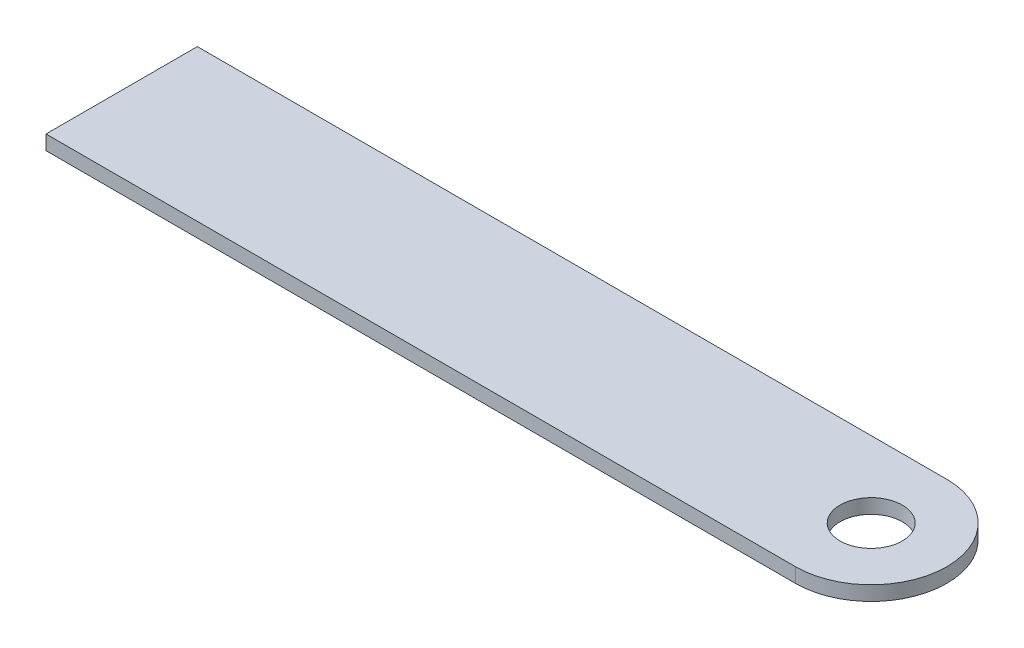
ISO-10303-21;
HEADER;
FILE_DESCRIPTION(('STEP AP214'),'2;1');
FILE_NAME('part.step','',(''),(''),'','','');
FILE_SCHEMA(('AUTOMOTIVE_DESIGN { 1 0 10303 214 1 1 1 1 }'));
ENDSEC;
DATA;
#1=APPLICATION_CONTEXT('core data for automotive mechanical design processes');
#2=APPLICATION_PROTOCOL_DEFINITION('international standard','automotive_design',2000,#1);
#3=PRODUCT_CONTEXT('',#1,'mechanical');
#4=PRODUCT('Part','Part','',(#3));
#5=PRODUCT_RELATED_PRODUCT_CATEGORY('part','',(#4));
#6=PRODUCT_DEFINITION_FORMATION('','',#4);
#7=PRODUCT_DEFINITION_CONTEXT('part definition',#1,'design');
#8=PRODUCT_DEFINITION('design','',#6,#7);
#9=PRODUCT_DEFINITION_SHAPE('','',#8);
#10=(LENGTH_UNIT() NAMED_UNIT(*) SI_UNIT(.MILLI.,.METRE.));
#11=(NAMED_UNIT(*) PLANE_ANGLE_UNIT() SI_UNIT($,.RADIAN.));
#12=(NAMED_UNIT(*) SI_UNIT($,.STERADIAN.) SOLID_ANGLE_UNIT());
#13=UNCERTAINTY_MEASURE_WITH_UNIT(LENGTH_MEASURE(1.E-05),#10,'distance_accuracy_value','');
#14=(GEOMETRIC_REPRESENTATION_CONTEXT(3) GLOBAL_UNCERTAINTY_ASSIGNED_CONTEXT((#13)) GLOBAL_UNIT_ASSIGNED_CONTEXT((#10,
#11,#12)) REPRESENTATION_CONTEXT('',''));
#15=CARTESIAN_POINT('',(0.,0.,0.));
#16=DIRECTION('',(0.,0.,1.));
#17=DIRECTION('',(1.,0.,0.));
#18=AXIS2_PLACEMENT_3D('',#15,#16,#17);
#19=CARTESIAN_POINT('',(1.14359601910806,0.,-15.875));
#20=DIRECTION('',(0.,0.,-1.));
#21=DIRECTION('',(0.,1.,0.));
#22=AXIS2_PLACEMENT_3D('',#19,#20,#21);
#23=PLANE('',#22);
#24=DIRECTION('',(1.,0.,0.));
#25=VECTOR('',#24,1.);
#26=CARTESIAN_POINT('',(1.14359601910806,0.,-15.875));
#27=LINE('',#26,#25);
#28=CARTESIAN_POINT('',(-65.9174839808919,4.55039132641043E-13,-15.875));
#29=VERTEX_POINT('',#28);
#30=CARTESIAN_POINT('',(12.7,0.,-15.875));
#31=VERTEX_POINT('',#30);
#32=EDGE_CURVE('E118',#29,#31,#27,.T.);
#33=ORIENTED_EDGE('',*,*,#32,.T.);
#34=DIRECTION('',(0.,1.,0.));
#35=VECTOR('',#34,1.);
#36=CARTESIAN_POINT('',(12.7,-1.51892,-15.875));
#37=LINE('',#36,#35);
#38=CARTESIAN_POINT('',(12.7,-1.51892,-15.875));
#39=VERTEX_POINT('',#38);
#40=EDGE_CURVE('E120',#39,#31,#37,.T.);
#41=ORIENTED_EDGE('',*,*,#40,.F.);
#42=DIRECTION('',(-1.,0.,0.));
#43=VECTOR('',#42,1.);
#44=CARTESIAN_POINT('',(2.66251601910805,-1.51892000000002,-15.875));
#45=LINE('',#44,#43);
#46=CARTESIAN_POINT('',(-65.9174839808919,-1.51891999999955,-15.875));
#47=VERTEX_POINT('',#46);
#48=EDGE_CURVE('E115',#47,#39,#45,.F.);
#49=ORIENTED_EDGE('',*,*,#48,.F.);
#50=DIRECTION('',(0.,-1.,0.));
#51=VECTOR('',#50,1.);
#52=CARTESIAN_POINT('',(-65.9174839808919,4.5498518210798E-13,-15.875));
#53=LINE('',#52,#51);
#54=EDGE_CURVE('E14',#29,#47,#53,.T.);
#55=ORIENTED_EDGE('',*,*,#54,.F.);
#56=EDGE_LOOP('',(#33,#41,#49,#55));
#57=FACE_BOUND('',#56,.T.);
#58=ADVANCED_FACE('F72',(#57),#23,.T.);
#59=CARTESIAN_POINT('',(-65.9174839808919,4.5498518210798E-13,0.));
#60=DIRECTION('',(0.,0.,1.));
#61=DIRECTION('',(0.,-1.,0.));
#62=AXIS2_PLACEMENT_3D('',#59,#60,#61);
#63=PLANE('',#62);
#64=DIRECTION('',(1.,0.,0.));
#65=VECTOR('',#64,1.);
#66=CARTESIAN_POINT('',(2.66251601910805,-1.51892000000002,0.));
#67=LINE('',#66,#65);
#68=CARTESIAN_POINT('',(12.7,-1.51892,0.));
#69=VERTEX_POINT('',#68);
#70=CARTESIAN_POINT('',(-65.9174839808919,-1.51891999999955,0.));
#71=VERTEX_POINT('',#70);
#72=EDGE_CURVE('E76',#69,#71,#67,.F.);
#73=ORIENTED_EDGE('',*,*,#72,.F.);
#74=DIRECTION('',(0.,1.,0.));
#75=VECTOR('',#74,1.);
#76=CARTESIAN_POINT('',(12.7,-1.51892,0.));
#77=LINE('',#76,#75);
#78=CARTESIAN_POINT('',(12.7,0.,0.));
#79=VERTEX_POINT('',#78);
#80=EDGE_CURVE('E136',#69,#79,#77,.T.);
#81=ORIENTED_EDGE('',*,*,#80,.T.);
#82=DIRECTION('',(-1.,0.,0.));
#83=VECTOR('',#82,1.);
#84=CARTESIAN_POINT('',(-65.9174839808919,4.55039132641043E-13,0.));
#85=LINE('',#84,#83);
#86=CARTESIAN_POINT('',(-65.9174839808919,4.55039132641043E-13,0.));
#87=VERTEX_POINT('',#86);
#88=EDGE_CURVE('E135',#79,#87,#85,.T.);
#89=ORIENTED_EDGE('',*,*,#88,.T.);
#90=DIRECTION('',(0.,-1.,0.));
#91=VECTOR('',#90,1.);
#92=CARTESIAN_POINT('',(-65.9174839808919,4.5498518210798E-13,0.));
#93=LINE('',#92,#91);
#94=EDGE_CURVE('E82',#87,#71,#93,.T.);
#95=ORIENTED_EDGE('',*,*,#94,.T.);
#96=EDGE_LOOP('',(#73,#81,#89,#95));
#97=FACE_BOUND('',#96,.T.);
#98=ADVANCED_FACE('F160',(#97),#63,.T.);
#99=CARTESIAN_POINT('',(12.7,0.,-7.9375));
#100=DIRECTION('',(0.,-1.,0.));
#101=DIRECTION('',(0.,0.,-1.));
#102=AXIS2_PLACEMENT_3D('',#99,#100,#101);
#103=PLANE('',#102);
#104=ORIENTED_EDGE('',*,*,#88,.F.);
#105=CARTESIAN_POINT('',(12.7,0.,-7.9375));
#106=DIRECTION('',(0.,1.,0.));
#107=DIRECTION('',(0.,0.,-1.));
#108=AXIS2_PLACEMENT_3D('',#105,#106,#107);
#109=CIRCLE('',#108,7.9375);
#110=EDGE_CURVE('E130',#79,#31,#109,.T.);
#111=ORIENTED_EDGE('',*,*,#110,.T.);
#112=ORIENTED_EDGE('',*,*,#32,.F.);
#113=DIRECTION('',(0.,0.,-1.));
#114=VECTOR('',#113,1.);
#115=CARTESIAN_POINT('',(-65.9174839808919,4.55039132641043E-13,-15.875));
#116=LINE('',#115,#114);
#117=EDGE_CURVE('E125',#87,#29,#116,.T.);
#118=ORIENTED_EDGE('',*,*,#117,.F.);
#119=EDGE_LOOP('',(#104,#111,#112,#118));
#120=FACE_BOUND('',#119,.T.);
#121=CARTESIAN_POINT('',(12.7,0.,-7.9375));
#122=DIRECTION('',(0.,1.,0.));
#123=DIRECTION('',(0.,0.,1.));
#124=AXIS2_PLACEMENT_3D('',#121,#122,#123);
#125=CIRCLE('',#124,3.2639);
#126=CARTESIAN_POINT('',(12.7,0.,-4.6736));
#127=VERTEX_POINT('',#126);
#128=EDGE_CURVE('E132',#127,#127,#125,.T.);
#129=ORIENTED_EDGE('',*,*,#128,.F.);
#130=EDGE_LOOP('',(#129));
#131=FACE_BOUND('',#130,.T.);
#132=ADVANCED_FACE('F74',(#120,#131),#103,.F.);
#133=CARTESIAN_POINT('',(2.66251601910805,-1.51892000000002,0.));
#134=DIRECTION('',(0.,1.,0.));
#135=DIRECTION('',(-1.,0.,0.));
#136=AXIS2_PLACEMENT_3D('',#133,#134,#135);
#137=PLANE('',#136);
#138=ORIENTED_EDGE('',*,*,#48,.T.);
#139=CARTESIAN_POINT('',(12.7,-1.51892,-7.9375));
#140=DIRECTION('',(0.,1.,0.));
#141=DIRECTION('',(0.,0.,-1.));
#142=AXIS2_PLACEMENT_3D('',#139,#140,#141);
#143=CIRCLE('',#142,7.9375);
#144=EDGE_CURVE('E131',#69,#39,#143,.T.);
#145=ORIENTED_EDGE('',*,*,#144,.F.);
#146=ORIENTED_EDGE('',*,*,#72,.T.);
#147=DIRECTION('',(0.,0.,1.));
#148=VECTOR('',#147,1.);
#149=CARTESIAN_POINT('',(-65.9174839808919,-1.51891999999955,0.));
#150=LINE('',#149,#148);
#151=EDGE_CURVE('E153',#71,#47,#150,.F.);
#152=ORIENTED_EDGE('',*,*,#151,.T.);
#153=EDGE_LOOP('',(#138,#145,#146,#152));
#154=FACE_BOUND('',#153,.T.);
#155=CARTESIAN_POINT('',(12.7,-1.51892,-7.9375));
#156=DIRECTION('',(0.,1.,0.));
#157=DIRECTION('',(0.,0.,1.));
#158=AXIS2_PLACEMENT_3D('',#155,#156,#157);
#159=CIRCLE('',#158,3.2639);
#160=CARTESIAN_POINT('',(12.7,-1.51892,-4.6736));
#161=VERTEX_POINT('',#160);
#162=EDGE_CURVE('E137',#161,#161,#159,.T.);
#163=ORIENTED_EDGE('',*,*,#162,.T.);
#164=EDGE_LOOP('',(#163));
#165=FACE_BOUND('',#164,.T.);
#166=ADVANCED_FACE('F156',(#154,#165),#137,.F.);
#167=CARTESIAN_POINT('',(-65.9174839808919,4.5498518210798E-13,-15.875));
#168=DIRECTION('',(-1.,0.,0.));
#169=DIRECTION('',(0.,-1.,0.));
#170=AXIS2_PLACEMENT_3D('',#167,#168,#169);
#171=PLANE('',#170);
#172=ORIENTED_EDGE('',*,*,#151,.F.);
#173=ORIENTED_EDGE('',*,*,#94,.F.);
#174=ORIENTED_EDGE('',*,*,#117,.T.);
#175=ORIENTED_EDGE('',*,*,#54,.T.);
#176=EDGE_LOOP('',(#172,#173,#174,#175));
#177=FACE_BOUND('',#176,.T.);
#178=ADVANCED_FACE('F159',(#177),#171,.T.);
#179=CARTESIAN_POINT('',(12.7,-1.51892,-7.9375));
#180=DIRECTION('',(0.,1.,0.));
#181=DIRECTION('',(0.,0.,1.));
#182=AXIS2_PLACEMENT_3D('',#179,#180,#181);
#183=CYLINDRICAL_SURFACE('',#182,7.9375);
#184=ORIENTED_EDGE('',*,*,#110,.F.);
#185=ORIENTED_EDGE('',*,*,#80,.F.);
#186=ORIENTED_EDGE('',*,*,#144,.T.);
#187=ORIENTED_EDGE('',*,*,#40,.T.);
#188=EDGE_LOOP('',(#184,#185,#186,#187));
#189=FACE_BOUND('',#188,.T.);
#190=ADVANCED_FACE('F129',(#189),#183,.T.);
#191=CARTESIAN_POINT('',(12.7,-1.51892,-7.9375));
#192=DIRECTION('',(0.,1.,0.));
#193=DIRECTION('',(0.,0.,1.));
#194=AXIS2_PLACEMENT_3D('',#191,#192,#193);
#195=CYLINDRICAL_SURFACE('',#194,3.2639);
#196=ORIENTED_EDGE('',*,*,#162,.F.);
#197=EDGE_LOOP('',(#196));
#198=FACE_BOUND('',#197,.T.);
#199=ORIENTED_EDGE('',*,*,#128,.T.);
#200=EDGE_LOOP('',(#199));
#201=FACE_BOUND('',#200,.T.);
#202=ADVANCED_FACE('F172',(#198,#201),#195,.F.);
#203=CLOSED_SHELL('',(#58,#98,#132,#166,#178,#190,#202));
#204=MANIFOLD_SOLID_BREP('B2',#203);
#205=ADVANCED_BREP_SHAPE_REPRESENTATION('',(#18,#204),#14);
#206=SHAPE_DEFINITION_REPRESENTATION(#9,#205);
ENDSEC;
END-ISO-10303-21;
